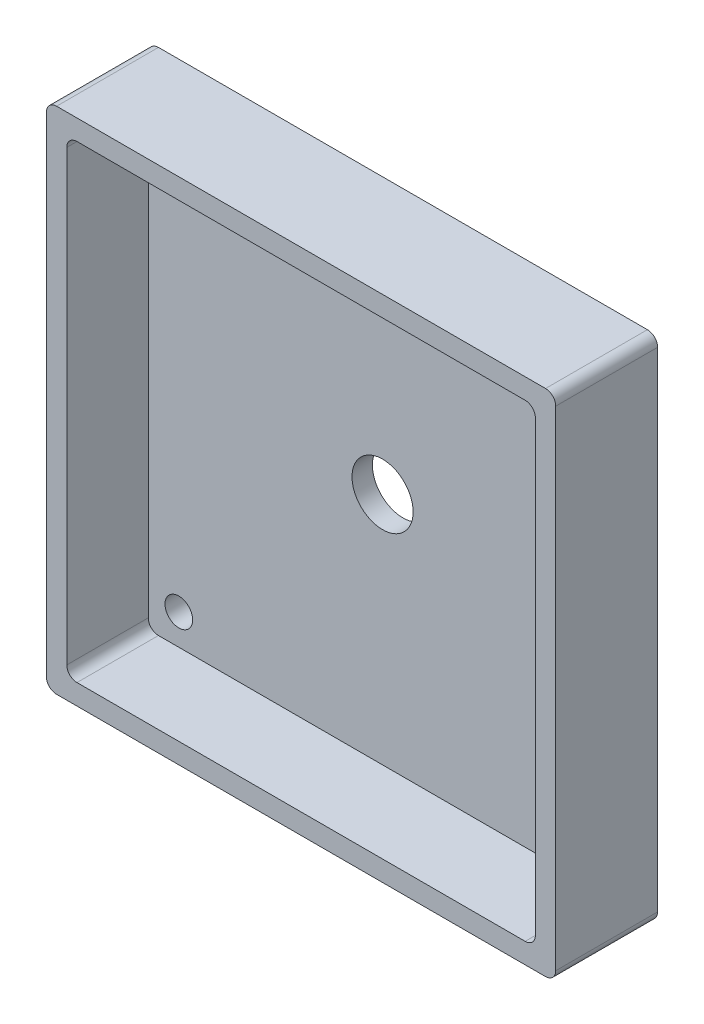
ISO-10303-21;
HEADER;
FILE_DESCRIPTION(('STEP AP214'),'2;1');
FILE_NAME('part.step','',(''),(''),'','','');
FILE_SCHEMA(('AUTOMOTIVE_DESIGN { 1 0 10303 214 1 1 1 1 }'));
ENDSEC;
DATA;
#1=APPLICATION_CONTEXT('core data for automotive mechanical design processes');
#2=APPLICATION_PROTOCOL_DEFINITION('international standard','automotive_design',2000,#1);
#3=PRODUCT_CONTEXT('',#1,'mechanical');
#4=PRODUCT('Part','Part','',(#3));
#5=PRODUCT_RELATED_PRODUCT_CATEGORY('part','',(#4));
#6=PRODUCT_DEFINITION_FORMATION('','',#4);
#7=PRODUCT_DEFINITION_CONTEXT('part definition',#1,'design');
#8=PRODUCT_DEFINITION('design','',#6,#7);
#9=PRODUCT_DEFINITION_SHAPE('','',#8);
#10=(LENGTH_UNIT() NAMED_UNIT(*) SI_UNIT(.MILLI.,.METRE.));
#11=(NAMED_UNIT(*) PLANE_ANGLE_UNIT() SI_UNIT($,.RADIAN.));
#12=(NAMED_UNIT(*) SI_UNIT($,.STERADIAN.) SOLID_ANGLE_UNIT());
#13=UNCERTAINTY_MEASURE_WITH_UNIT(LENGTH_MEASURE(1.E-05),#10,'distance_accuracy_value','');
#14=(GEOMETRIC_REPRESENTATION_CONTEXT(3) GLOBAL_UNCERTAINTY_ASSIGNED_CONTEXT((#13)) GLOBAL_UNIT_ASSIGNED_CONTEXT((#10,
#11,#12)) REPRESENTATION_CONTEXT('',''));
#15=CARTESIAN_POINT('',(0.,0.,0.));
#16=DIRECTION('',(0.,0.,1.));
#17=DIRECTION('',(1.,0.,0.));
#18=AXIS2_PLACEMENT_3D('',#15,#16,#17);
#19=CARTESIAN_POINT('',(-50.,50.,20.));
#20=DIRECTION('',(1.,0.,0.));
#21=DIRECTION('',(0.,1.,0.));
#22=AXIS2_PLACEMENT_3D('',#19,#20,#21);
#23=PLANE('',#22);
#24=DIRECTION('',(0.,-1.,0.));
#25=VECTOR('',#24,1.);
#26=CARTESIAN_POINT('',(-50.,50.,0.));
#27=LINE('',#26,#25);
#28=CARTESIAN_POINT('',(-50.,48.,0.));
#29=VERTEX_POINT('',#28);
#30=CARTESIAN_POINT('',(-50.,-48.,0.));
#31=VERTEX_POINT('',#30);
#32=EDGE_CURVE('E204',#29,#31,#27,.T.);
#33=ORIENTED_EDGE('',*,*,#32,.T.);
#34=DIRECTION('',(0.,0.,-1.));
#35=VECTOR('',#34,1.);
#36=CARTESIAN_POINT('',(-50.,-48.,20.));
#37=LINE('',#36,#35);
#38=CARTESIAN_POINT('',(-50.,-48.,20.));
#39=VERTEX_POINT('',#38);
#40=EDGE_CURVE('E264',#31,#39,#37,.F.);
#41=ORIENTED_EDGE('',*,*,#40,.T.);
#42=DIRECTION('',(0.,-1.,0.));
#43=VECTOR('',#42,1.);
#44=CARTESIAN_POINT('',(-50.,50.,20.));
#45=LINE('',#44,#43);
#46=CARTESIAN_POINT('',(-50.,48.,20.));
#47=VERTEX_POINT('',#46);
#48=EDGE_CURVE('E193',#47,#39,#45,.T.);
#49=ORIENTED_EDGE('',*,*,#48,.F.);
#50=DIRECTION('',(0.,0.,-1.));
#51=VECTOR('',#50,1.);
#52=CARTESIAN_POINT('',(-50.,48.,20.));
#53=LINE('',#52,#51);
#54=EDGE_CURVE('E261',#47,#29,#53,.T.);
#55=ORIENTED_EDGE('',*,*,#54,.T.);
#56=EDGE_LOOP('',(#33,#41,#49,#55));
#57=FACE_BOUND('',#56,.T.);
#58=ADVANCED_FACE('F37',(#57),#23,.F.);
#59=CARTESIAN_POINT('',(50.,-50.,20.));
#60=DIRECTION('',(0.,1.,0.));
#61=DIRECTION('',(-1.,0.,0.));
#62=AXIS2_PLACEMENT_3D('',#59,#60,#61);
#63=PLANE('',#62);
#64=DIRECTION('',(1.,0.,0.));
#65=VECTOR('',#64,1.);
#66=CARTESIAN_POINT('',(50.,-50.,0.));
#67=LINE('',#66,#65);
#68=CARTESIAN_POINT('',(-48.,-50.,0.));
#69=VERTEX_POINT('',#68);
#70=CARTESIAN_POINT('',(48.,-50.,0.));
#71=VERTEX_POINT('',#70);
#72=EDGE_CURVE('E207',#69,#71,#67,.T.);
#73=ORIENTED_EDGE('',*,*,#72,.T.);
#74=DIRECTION('',(0.,0.,-1.));
#75=VECTOR('',#74,1.);
#76=CARTESIAN_POINT('',(48.,-50.,20.));
#77=LINE('',#76,#75);
#78=CARTESIAN_POINT('',(48.,-50.,20.));
#79=VERTEX_POINT('',#78);
#80=EDGE_CURVE('E252',#71,#79,#77,.F.);
#81=ORIENTED_EDGE('',*,*,#80,.T.);
#82=DIRECTION('',(1.,0.,0.));
#83=VECTOR('',#82,1.);
#84=CARTESIAN_POINT('',(50.,-50.,20.));
#85=LINE('',#84,#83);
#86=CARTESIAN_POINT('',(-48.,-50.,20.));
#87=VERTEX_POINT('',#86);
#88=EDGE_CURVE('E196',#87,#79,#85,.T.);
#89=ORIENTED_EDGE('',*,*,#88,.F.);
#90=DIRECTION('',(0.,0.,-1.));
#91=VECTOR('',#90,1.);
#92=CARTESIAN_POINT('',(-48.,-50.,20.));
#93=LINE('',#92,#91);
#94=EDGE_CURVE('E249',#87,#69,#93,.T.);
#95=ORIENTED_EDGE('',*,*,#94,.T.);
#96=EDGE_LOOP('',(#73,#81,#89,#95));
#97=FACE_BOUND('',#96,.T.);
#98=ADVANCED_FACE('F352',(#97),#63,.F.);
#99=CARTESIAN_POINT('',(50.,50.,20.));
#100=DIRECTION('',(-1.,0.,0.));
#101=DIRECTION('',(0.,-1.,0.));
#102=AXIS2_PLACEMENT_3D('',#99,#100,#101);
#103=PLANE('',#102);
#104=DIRECTION('',(0.,1.,0.));
#105=VECTOR('',#104,1.);
#106=CARTESIAN_POINT('',(50.,50.,20.));
#107=LINE('',#106,#105);
#108=CARTESIAN_POINT('',(50.,-48.,20.));
#109=VERTEX_POINT('',#108);
#110=CARTESIAN_POINT('',(50.,48.,20.));
#111=VERTEX_POINT('',#110);
#112=EDGE_CURVE('E200',#109,#111,#107,.T.);
#113=ORIENTED_EDGE('',*,*,#112,.F.);
#114=DIRECTION('',(0.,0.,-1.));
#115=VECTOR('',#114,1.);
#116=CARTESIAN_POINT('',(50.,-48.,20.));
#117=LINE('',#116,#115);
#118=CARTESIAN_POINT('',(50.,-48.,0.));
#119=VERTEX_POINT('',#118);
#120=EDGE_CURVE('E238',#109,#119,#117,.T.);
#121=ORIENTED_EDGE('',*,*,#120,.T.);
#122=DIRECTION('',(0.,1.,0.));
#123=VECTOR('',#122,1.);
#124=CARTESIAN_POINT('',(50.,50.,0.));
#125=LINE('',#124,#123);
#126=CARTESIAN_POINT('',(50.,48.,0.));
#127=VERTEX_POINT('',#126);
#128=EDGE_CURVE('E210',#119,#127,#125,.T.);
#129=ORIENTED_EDGE('',*,*,#128,.T.);
#130=DIRECTION('',(0.,0.,-1.));
#131=VECTOR('',#130,1.);
#132=CARTESIAN_POINT('',(50.,48.,20.));
#133=LINE('',#132,#131);
#134=EDGE_CURVE('E236',#127,#111,#133,.F.);
#135=ORIENTED_EDGE('',*,*,#134,.T.);
#136=EDGE_LOOP('',(#113,#121,#129,#135));
#137=FACE_BOUND('',#136,.T.);
#138=ADVANCED_FACE('F358',(#137),#103,.F.);
#139=CARTESIAN_POINT('',(50.,50.,20.));
#140=DIRECTION('',(0.,-1.,0.));
#141=DIRECTION('',(1.,0.,0.));
#142=AXIS2_PLACEMENT_3D('',#139,#140,#141);
#143=PLANE('',#142);
#144=DIRECTION('',(-1.,0.,0.));
#145=VECTOR('',#144,1.);
#146=CARTESIAN_POINT('',(50.,50.,0.));
#147=LINE('',#146,#145);
#148=CARTESIAN_POINT('',(48.,50.,0.));
#149=VERTEX_POINT('',#148);
#150=CARTESIAN_POINT('',(-48.,50.,0.));
#151=VERTEX_POINT('',#150);
#152=EDGE_CURVE('E197',#149,#151,#147,.T.);
#153=ORIENTED_EDGE('',*,*,#152,.T.);
#154=DIRECTION('',(0.,0.,-1.));
#155=VECTOR('',#154,1.);
#156=CARTESIAN_POINT('',(-48.,50.,20.));
#157=LINE('',#156,#155);
#158=CARTESIAN_POINT('',(-48.,50.,20.));
#159=VERTEX_POINT('',#158);
#160=EDGE_CURVE('E54',#151,#159,#157,.F.);
#161=ORIENTED_EDGE('',*,*,#160,.T.);
#162=DIRECTION('',(-1.,0.,0.));
#163=VECTOR('',#162,1.);
#164=CARTESIAN_POINT('',(50.,50.,20.));
#165=LINE('',#164,#163);
#166=CARTESIAN_POINT('',(48.,50.,20.));
#167=VERTEX_POINT('',#166);
#168=EDGE_CURVE('E202',#167,#159,#165,.T.);
#169=ORIENTED_EDGE('',*,*,#168,.F.);
#170=DIRECTION('',(0.,0.,-1.));
#171=VECTOR('',#170,1.);
#172=CARTESIAN_POINT('',(48.,50.,20.));
#173=LINE('',#172,#171);
#174=EDGE_CURVE('E266',#167,#149,#173,.T.);
#175=ORIENTED_EDGE('',*,*,#174,.T.);
#176=EDGE_LOOP('',(#153,#161,#169,#175));
#177=FACE_BOUND('',#176,.T.);
#178=ADVANCED_FACE('F549',(#177),#143,.F.);
#179=CARTESIAN_POINT('',(0.,0.,20.));
#180=DIRECTION('',(0.,0.,-1.));
#181=DIRECTION('',(-1.,0.,0.));
#182=AXIS2_PLACEMENT_3D('',#179,#180,#181);
#183=PLANE('',#182);
#184=DIRECTION('',(1.,0.,0.));
#185=VECTOR('',#184,1.);
#186=CARTESIAN_POINT('',(46.,-46.,20.));
#187=LINE('',#186,#185);
#188=CARTESIAN_POINT('',(-44.,-46.,20.));
#189=VERTEX_POINT('',#188);
#190=CARTESIAN_POINT('',(44.,-46.,20.));
#191=VERTEX_POINT('',#190);
#192=EDGE_CURVE('E178',#189,#191,#187,.T.);
#193=ORIENTED_EDGE('',*,*,#192,.F.);
#194=CARTESIAN_POINT('',(-44.,-44.,20.));
#195=DIRECTION('',(0.,0.,-1.));
#196=DIRECTION('',(-1.,0.,0.));
#197=AXIS2_PLACEMENT_3D('',#194,#195,#196);
#198=CIRCLE('',#197,2.);
#199=CARTESIAN_POINT('',(-46.,-44.,20.));
#200=VERTEX_POINT('',#199);
#201=EDGE_CURVE('E11',#189,#200,#198,.T.);
#202=ORIENTED_EDGE('',*,*,#201,.T.);
#203=DIRECTION('',(0.,-1.,0.));
#204=VECTOR('',#203,1.);
#205=CARTESIAN_POINT('',(-46.,-46.,20.));
#206=LINE('',#205,#204);
#207=CARTESIAN_POINT('',(-46.,44.,20.));
#208=VERTEX_POINT('',#207);
#209=EDGE_CURVE('E169',#208,#200,#206,.T.);
#210=ORIENTED_EDGE('',*,*,#209,.F.);
#211=CARTESIAN_POINT('',(-44.,44.,20.));
#212=DIRECTION('',(0.,0.,-1.));
#213=DIRECTION('',(-1.,0.,0.));
#214=AXIS2_PLACEMENT_3D('',#211,#212,#213);
#215=CIRCLE('',#214,2.);
#216=CARTESIAN_POINT('',(-44.,46.,20.));
#217=VERTEX_POINT('',#216);
#218=EDGE_CURVE('E153',#208,#217,#215,.T.);
#219=ORIENTED_EDGE('',*,*,#218,.T.);
#220=DIRECTION('',(-1.,0.,0.));
#221=VECTOR('',#220,1.);
#222=CARTESIAN_POINT('',(46.,46.,20.));
#223=LINE('',#222,#221);
#224=CARTESIAN_POINT('',(44.,46.,20.));
#225=VERTEX_POINT('',#224);
#226=EDGE_CURVE('E191',#225,#217,#223,.T.);
#227=ORIENTED_EDGE('',*,*,#226,.F.);
#228=CARTESIAN_POINT('',(44.,44.,20.));
#229=DIRECTION('',(0.,0.,-1.));
#230=DIRECTION('',(-1.,0.,0.));
#231=AXIS2_PLACEMENT_3D('',#228,#229,#230);
#232=CIRCLE('',#231,2.);
#233=CARTESIAN_POINT('',(46.,44.,20.));
#234=VERTEX_POINT('',#233);
#235=EDGE_CURVE('E163',#225,#234,#232,.T.);
#236=ORIENTED_EDGE('',*,*,#235,.T.);
#237=DIRECTION('',(0.,1.,0.));
#238=VECTOR('',#237,1.);
#239=CARTESIAN_POINT('',(46.,-46.,20.));
#240=LINE('',#239,#238);
#241=CARTESIAN_POINT('',(46.,-44.,20.));
#242=VERTEX_POINT('',#241);
#243=EDGE_CURVE('E181',#242,#234,#240,.T.);
#244=ORIENTED_EDGE('',*,*,#243,.F.);
#245=CARTESIAN_POINT('',(44.,-44.,20.));
#246=DIRECTION('',(0.,0.,-1.));
#247=DIRECTION('',(-1.,0.,0.));
#248=AXIS2_PLACEMENT_3D('',#245,#246,#247);
#249=CIRCLE('',#248,2.);
#250=EDGE_CURVE('E46',#242,#191,#249,.T.);
#251=ORIENTED_EDGE('',*,*,#250,.T.);
#252=EDGE_LOOP('',(#193,#202,#210,#219,#227,#236,#244,#251));
#253=FACE_BOUND('',#252,.T.);
#254=ORIENTED_EDGE('',*,*,#88,.T.);
#255=CARTESIAN_POINT('',(48.,-48.,20.));
#256=DIRECTION('',(0.,0.,-1.));
#257=DIRECTION('',(-1.,0.,0.));
#258=AXIS2_PLACEMENT_3D('',#255,#256,#257);
#259=CIRCLE('',#258,2.);
#260=EDGE_CURVE('E259',#79,#109,#259,.F.);
#261=ORIENTED_EDGE('',*,*,#260,.T.);
#262=ORIENTED_EDGE('',*,*,#112,.T.);
#263=CARTESIAN_POINT('',(48.,48.,20.));
#264=DIRECTION('',(0.,0.,-1.));
#265=DIRECTION('',(-1.,0.,0.));
#266=AXIS2_PLACEMENT_3D('',#263,#264,#265);
#267=CIRCLE('',#266,2.);
#268=EDGE_CURVE('E61',#111,#167,#267,.F.);
#269=ORIENTED_EDGE('',*,*,#268,.T.);
#270=ORIENTED_EDGE('',*,*,#168,.T.);
#271=CARTESIAN_POINT('',(-48.,48.,20.));
#272=DIRECTION('',(0.,0.,-1.));
#273=DIRECTION('',(-1.,0.,0.));
#274=AXIS2_PLACEMENT_3D('',#271,#272,#273);
#275=CIRCLE('',#274,2.);
#276=EDGE_CURVE('E255',#159,#47,#275,.F.);
#277=ORIENTED_EDGE('',*,*,#276,.T.);
#278=ORIENTED_EDGE('',*,*,#48,.T.);
#279=CARTESIAN_POINT('',(-48.,-48.,20.));
#280=DIRECTION('',(0.,0.,-1.));
#281=DIRECTION('',(-1.,0.,0.));
#282=AXIS2_PLACEMENT_3D('',#279,#280,#281);
#283=CIRCLE('',#282,2.);
#284=EDGE_CURVE('E257',#39,#87,#283,.F.);
#285=ORIENTED_EDGE('',*,*,#284,.T.);
#286=EDGE_LOOP('',(#254,#261,#262,#269,#270,#277,#278,#285));
#287=FACE_BOUND('',#286,.T.);
#288=ADVANCED_FACE('F177',(#253,#287),#183,.F.);
#289=CARTESIAN_POINT('',(0.,0.,0.));
#290=DIRECTION('',(0.,0.,-1.));
#291=DIRECTION('',(-1.,0.,0.));
#292=AXIS2_PLACEMENT_3D('',#289,#290,#291);
#293=PLANE('',#292);
#294=CARTESIAN_POINT('',(-39.9999999999977,-40.,0.));
#295=DIRECTION('',(0.,0.,1.));
#296=DIRECTION('',(1.,0.,0.));
#297=AXIS2_PLACEMENT_3D('',#294,#295,#296);
#298=CIRCLE('',#297,2.71396680124798);
#299=CARTESIAN_POINT('',(-37.2860331987498,-40.,0.));
#300=VERTEX_POINT('',#299);
#301=EDGE_CURVE('E298',#300,#300,#298,.T.);
#302=ORIENTED_EDGE('',*,*,#301,.T.);
#303=EDGE_LOOP('',(#302));
#304=FACE_BOUND('',#303,.T.);
#305=CARTESIAN_POINT('',(40.0000000000023,-39.9999999999978,0.));
#306=DIRECTION('',(0.,0.,1.));
#307=DIRECTION('',(1.,0.,0.));
#308=AXIS2_PLACEMENT_3D('',#305,#306,#307);
#309=CIRCLE('',#308,2.71396680124995);
#310=CARTESIAN_POINT('',(42.7139668012522,-39.9999999999978,0.));
#311=VERTEX_POINT('',#310);
#312=EDGE_CURVE('E295',#311,#311,#309,.T.);
#313=ORIENTED_EDGE('',*,*,#312,.T.);
#314=EDGE_LOOP('',(#313));
#315=FACE_BOUND('',#314,.T.);
#316=CARTESIAN_POINT('',(40.,40.0000000000023,0.));
#317=DIRECTION('',(0.,0.,1.));
#318=DIRECTION('',(1.,0.,0.));
#319=AXIS2_PLACEMENT_3D('',#316,#317,#318);
#320=CIRCLE('',#319,2.71396680124912);
#321=CARTESIAN_POINT('',(42.7139668012491,40.0000000000023,0.));
#322=VERTEX_POINT('',#321);
#323=EDGE_CURVE('E297',#322,#322,#320,.T.);
#324=ORIENTED_EDGE('',*,*,#323,.T.);
#325=EDGE_LOOP('',(#324));
#326=FACE_BOUND('',#325,.T.);
#327=CARTESIAN_POINT('',(-40.,40.,0.));
#328=DIRECTION('',(0.,0.,1.));
#329=DIRECTION('',(1.,0.,0.));
#330=AXIS2_PLACEMENT_3D('',#327,#328,#329);
#331=CIRCLE('',#330,2.71396680124678);
#332=CARTESIAN_POINT('',(-37.2860331987532,40.,0.));
#333=VERTEX_POINT('',#332);
#334=EDGE_CURVE('E301',#333,#333,#331,.T.);
#335=ORIENTED_EDGE('',*,*,#334,.T.);
#336=EDGE_LOOP('',(#335));
#337=FACE_BOUND('',#336,.T.);
#338=CARTESIAN_POINT('',(0.,0.,0.));
#339=DIRECTION('',(0.,0.,1.));
#340=DIRECTION('',(1.,0.,0.));
#341=AXIS2_PLACEMENT_3D('',#338,#339,#340);
#342=CIRCLE('',#341,6.);
#343=CARTESIAN_POINT('',(6.,0.,0.));
#344=VERTEX_POINT('',#343);
#345=EDGE_CURVE('E276',#344,#344,#342,.T.);
#346=ORIENTED_EDGE('',*,*,#345,.T.);
#347=EDGE_LOOP('',(#346));
#348=FACE_BOUND('',#347,.T.);
#349=ORIENTED_EDGE('',*,*,#128,.F.);
#350=CARTESIAN_POINT('',(48.,-48.,0.));
#351=DIRECTION('',(0.,0.,-1.));
#352=DIRECTION('',(-1.,0.,0.));
#353=AXIS2_PLACEMENT_3D('',#350,#351,#352);
#354=CIRCLE('',#353,2.);
#355=EDGE_CURVE('E247',#119,#71,#354,.T.);
#356=ORIENTED_EDGE('',*,*,#355,.T.);
#357=ORIENTED_EDGE('',*,*,#72,.F.);
#358=CARTESIAN_POINT('',(-48.,-48.,0.));
#359=DIRECTION('',(0.,0.,-1.));
#360=DIRECTION('',(-1.,0.,0.));
#361=AXIS2_PLACEMENT_3D('',#358,#359,#360);
#362=CIRCLE('',#361,2.);
#363=EDGE_CURVE('E245',#69,#31,#362,.T.);
#364=ORIENTED_EDGE('',*,*,#363,.T.);
#365=ORIENTED_EDGE('',*,*,#32,.F.);
#366=CARTESIAN_POINT('',(-48.,48.,0.));
#367=DIRECTION('',(0.,0.,-1.));
#368=DIRECTION('',(-1.,0.,0.));
#369=AXIS2_PLACEMENT_3D('',#366,#367,#368);
#370=CIRCLE('',#369,2.);
#371=EDGE_CURVE('E243',#29,#151,#370,.T.);
#372=ORIENTED_EDGE('',*,*,#371,.T.);
#373=ORIENTED_EDGE('',*,*,#152,.F.);
#374=CARTESIAN_POINT('',(48.,48.,0.));
#375=DIRECTION('',(0.,0.,-1.));
#376=DIRECTION('',(-1.,0.,0.));
#377=AXIS2_PLACEMENT_3D('',#374,#375,#376);
#378=CIRCLE('',#377,2.);
#379=EDGE_CURVE('E241',#149,#127,#378,.T.);
#380=ORIENTED_EDGE('',*,*,#379,.T.);
#381=EDGE_LOOP('',(#349,#356,#357,#364,#365,#372,#373,#380));
#382=FACE_BOUND('',#381,.T.);
#383=ADVANCED_FACE('F425',(#304,#315,#326,#337,#348,#382),#293,.T.);
#384=CARTESIAN_POINT('',(-46.,-46.,4.));
#385=DIRECTION('',(-1.,0.,0.));
#386=DIRECTION('',(0.,0.,1.));
#387=AXIS2_PLACEMENT_3D('',#384,#385,#386);
#388=PLANE('',#387);
#389=DIRECTION('',(0.,-1.,0.));
#390=VECTOR('',#389,1.);
#391=CARTESIAN_POINT('',(-46.,-46.,4.));
#392=LINE('',#391,#390);
#393=CARTESIAN_POINT('',(-46.,44.,4.));
#394=VERTEX_POINT('',#393);
#395=CARTESIAN_POINT('',(-46.,-44.,4.));
#396=VERTEX_POINT('',#395);
#397=EDGE_CURVE('E172',#394,#396,#392,.T.);
#398=ORIENTED_EDGE('',*,*,#397,.F.);
#399=DIRECTION('',(0.,0.,1.));
#400=VECTOR('',#399,1.);
#401=CARTESIAN_POINT('',(-46.,44.,20.));
#402=LINE('',#401,#400);
#403=EDGE_CURVE('E157',#394,#208,#402,.T.);
#404=ORIENTED_EDGE('',*,*,#403,.T.);
#405=ORIENTED_EDGE('',*,*,#209,.T.);
#406=DIRECTION('',(0.,0.,1.));
#407=VECTOR('',#406,1.);
#408=CARTESIAN_POINT('',(-46.,-44.,4.));
#409=LINE('',#408,#407);
#410=EDGE_CURVE('E174',#200,#396,#409,.F.);
#411=ORIENTED_EDGE('',*,*,#410,.T.);
#412=EDGE_LOOP('',(#398,#404,#405,#411));
#413=FACE_BOUND('',#412,.T.);
#414=ADVANCED_FACE('F168',(#413),#388,.F.);
#415=CARTESIAN_POINT('',(46.,46.,4.));
#416=DIRECTION('',(0.,1.,0.));
#417=DIRECTION('',(-1.,0.,0.));
#418=AXIS2_PLACEMENT_3D('',#415,#416,#417);
#419=PLANE('',#418);
#420=ORIENTED_EDGE('',*,*,#226,.T.);
#421=DIRECTION('',(0.,0.,1.));
#422=VECTOR('',#421,1.);
#423=CARTESIAN_POINT('',(-44.,46.,4.));
#424=LINE('',#423,#422);
#425=CARTESIAN_POINT('',(-44.,46.,4.));
#426=VERTEX_POINT('',#425);
#427=EDGE_CURVE('E158',#217,#426,#424,.F.);
#428=ORIENTED_EDGE('',*,*,#427,.T.);
#429=DIRECTION('',(-1.,0.,0.));
#430=VECTOR('',#429,1.);
#431=CARTESIAN_POINT('',(46.,46.,4.));
#432=LINE('',#431,#430);
#433=CARTESIAN_POINT('',(44.,46.,4.));
#434=VERTEX_POINT('',#433);
#435=EDGE_CURVE('E186',#434,#426,#432,.T.);
#436=ORIENTED_EDGE('',*,*,#435,.F.);
#437=DIRECTION('',(0.,0.,1.));
#438=VECTOR('',#437,1.);
#439=CARTESIAN_POINT('',(44.,46.,20.));
#440=LINE('',#439,#438);
#441=EDGE_CURVE('E173',#434,#225,#440,.T.);
#442=ORIENTED_EDGE('',*,*,#441,.T.);
#443=EDGE_LOOP('',(#420,#428,#436,#442));
#444=FACE_BOUND('',#443,.T.);
#445=ADVANCED_FACE('F321',(#444),#419,.F.);
#446=CARTESIAN_POINT('',(46.,-46.,4.));
#447=DIRECTION('',(1.,0.,0.));
#448=DIRECTION('',(0.,0.,-1.));
#449=AXIS2_PLACEMENT_3D('',#446,#447,#448);
#450=PLANE('',#449);
#451=ORIENTED_EDGE('',*,*,#243,.T.);
#452=DIRECTION('',(0.,0.,1.));
#453=VECTOR('',#452,1.);
#454=CARTESIAN_POINT('',(46.,44.,4.));
#455=LINE('',#454,#453);
#456=CARTESIAN_POINT('',(46.,44.,4.));
#457=VERTEX_POINT('',#456);
#458=EDGE_CURVE('E229',#234,#457,#455,.F.);
#459=ORIENTED_EDGE('',*,*,#458,.T.);
#460=DIRECTION('',(0.,1.,0.));
#461=VECTOR('',#460,1.);
#462=CARTESIAN_POINT('',(46.,-46.,4.));
#463=LINE('',#462,#461);
#464=CARTESIAN_POINT('',(46.,-44.,4.));
#465=VERTEX_POINT('',#464);
#466=EDGE_CURVE('E312',#465,#457,#463,.T.);
#467=ORIENTED_EDGE('',*,*,#466,.F.);
#468=DIRECTION('',(0.,0.,1.));
#469=VECTOR('',#468,1.);
#470=CARTESIAN_POINT('',(46.,-44.,20.));
#471=LINE('',#470,#469);
#472=EDGE_CURVE('E226',#465,#242,#471,.T.);
#473=ORIENTED_EDGE('',*,*,#472,.T.);
#474=EDGE_LOOP('',(#451,#459,#467,#473));
#475=FACE_BOUND('',#474,.T.);
#476=ADVANCED_FACE('F327',(#475),#450,.F.);
#477=CARTESIAN_POINT('',(46.,-46.,4.));
#478=DIRECTION('',(0.,-1.,0.));
#479=DIRECTION('',(1.,0.,0.));
#480=AXIS2_PLACEMENT_3D('',#477,#478,#479);
#481=PLANE('',#480);
#482=ORIENTED_EDGE('',*,*,#192,.T.);
#483=DIRECTION('',(0.,0.,1.));
#484=VECTOR('',#483,1.);
#485=CARTESIAN_POINT('',(44.,-46.,4.));
#486=LINE('',#485,#484);
#487=CARTESIAN_POINT('',(44.,-46.,4.));
#488=VERTEX_POINT('',#487);
#489=EDGE_CURVE('E234',#191,#488,#486,.F.);
#490=ORIENTED_EDGE('',*,*,#489,.T.);
#491=DIRECTION('',(1.,0.,0.));
#492=VECTOR('',#491,1.);
#493=CARTESIAN_POINT('',(46.,-46.,4.));
#494=LINE('',#493,#492);
#495=CARTESIAN_POINT('',(-44.,-46.,4.));
#496=VERTEX_POINT('',#495);
#497=EDGE_CURVE('E310',#496,#488,#494,.T.);
#498=ORIENTED_EDGE('',*,*,#497,.F.);
#499=DIRECTION('',(0.,0.,1.));
#500=VECTOR('',#499,1.);
#501=CARTESIAN_POINT('',(-44.,-46.,20.));
#502=LINE('',#501,#500);
#503=EDGE_CURVE('E231',#496,#189,#502,.T.);
#504=ORIENTED_EDGE('',*,*,#503,.T.);
#505=EDGE_LOOP('',(#482,#490,#498,#504));
#506=FACE_BOUND('',#505,.T.);
#507=ADVANCED_FACE('F334',(#506),#481,.F.);
#508=CARTESIAN_POINT('',(0.,0.,4.));
#509=DIRECTION('',(0.,0.,1.));
#510=DIRECTION('',(1.,0.,0.));
#511=AXIS2_PLACEMENT_3D('',#508,#509,#510);
#512=PLANE('',#511);
#513=CARTESIAN_POINT('',(-39.9999999999977,-40.,4.));
#514=DIRECTION('',(0.,0.,1.));
#515=DIRECTION('',(1.,0.,0.));
#516=AXIS2_PLACEMENT_3D('',#513,#514,#515);
#517=CIRCLE('',#516,2.71396680124798);
#518=CARTESIAN_POINT('',(-37.2860331987498,-40.,4.));
#519=VERTEX_POINT('',#518);
#520=EDGE_CURVE('E41',#519,#519,#517,.F.);
#521=ORIENTED_EDGE('',*,*,#520,.T.);
#522=EDGE_LOOP('',(#521));
#523=FACE_BOUND('',#522,.T.);
#524=CARTESIAN_POINT('',(40.0000000000023,-39.9999999999978,4.));
#525=DIRECTION('',(0.,0.,1.));
#526=DIRECTION('',(1.,0.,0.));
#527=AXIS2_PLACEMENT_3D('',#524,#525,#526);
#528=CIRCLE('',#527,2.71396680124995);
#529=CARTESIAN_POINT('',(42.7139668012522,-39.9999999999978,4.));
#530=VERTEX_POINT('',#529);
#531=EDGE_CURVE('E184',#530,#530,#528,.F.);
#532=ORIENTED_EDGE('',*,*,#531,.T.);
#533=EDGE_LOOP('',(#532));
#534=FACE_BOUND('',#533,.T.);
#535=CARTESIAN_POINT('',(40.,40.0000000000023,4.));
#536=DIRECTION('',(0.,0.,1.));
#537=DIRECTION('',(1.,0.,0.));
#538=AXIS2_PLACEMENT_3D('',#535,#536,#537);
#539=CIRCLE('',#538,2.71396680124912);
#540=CARTESIAN_POINT('',(42.7139668012491,40.0000000000023,4.));
#541=VERTEX_POINT('',#540);
#542=EDGE_CURVE('E279',#541,#541,#539,.F.);
#543=ORIENTED_EDGE('',*,*,#542,.T.);
#544=EDGE_LOOP('',(#543));
#545=FACE_BOUND('',#544,.T.);
#546=CARTESIAN_POINT('',(-40.,40.,4.));
#547=DIRECTION('',(0.,0.,1.));
#548=DIRECTION('',(1.,0.,0.));
#549=AXIS2_PLACEMENT_3D('',#546,#547,#548);
#550=CIRCLE('',#549,2.71396680124678);
#551=CARTESIAN_POINT('',(-37.2860331987532,40.,4.));
#552=VERTEX_POINT('',#551);
#553=EDGE_CURVE('E275',#552,#552,#550,.F.);
#554=ORIENTED_EDGE('',*,*,#553,.T.);
#555=EDGE_LOOP('',(#554));
#556=FACE_BOUND('',#555,.T.);
#557=CARTESIAN_POINT('',(0.,0.,4.));
#558=DIRECTION('',(0.,0.,1.));
#559=DIRECTION('',(1.,0.,0.));
#560=AXIS2_PLACEMENT_3D('',#557,#558,#559);
#561=CIRCLE('',#560,6.);
#562=CARTESIAN_POINT('',(6.,0.,4.));
#563=VERTEX_POINT('',#562);
#564=EDGE_CURVE('E272',#563,#563,#561,.F.);
#565=ORIENTED_EDGE('',*,*,#564,.T.);
#566=EDGE_LOOP('',(#565));
#567=FACE_BOUND('',#566,.T.);
#568=ORIENTED_EDGE('',*,*,#435,.T.);
#569=CARTESIAN_POINT('',(-44.,44.,4.));
#570=DIRECTION('',(0.,0.,1.));
#571=DIRECTION('',(1.,0.,0.));
#572=AXIS2_PLACEMENT_3D('',#569,#570,#571);
#573=CIRCLE('',#572,2.);
#574=EDGE_CURVE('E224',#426,#394,#573,.T.);
#575=ORIENTED_EDGE('',*,*,#574,.T.);
#576=ORIENTED_EDGE('',*,*,#397,.T.);
#577=CARTESIAN_POINT('',(-44.,-44.,4.));
#578=DIRECTION('',(0.,0.,1.));
#579=DIRECTION('',(1.,0.,0.));
#580=AXIS2_PLACEMENT_3D('',#577,#578,#579);
#581=CIRCLE('',#580,2.);
#582=EDGE_CURVE('E218',#396,#496,#581,.T.);
#583=ORIENTED_EDGE('',*,*,#582,.T.);
#584=ORIENTED_EDGE('',*,*,#497,.T.);
#585=CARTESIAN_POINT('',(44.,-44.,4.));
#586=DIRECTION('',(0.,0.,1.));
#587=DIRECTION('',(1.,0.,0.));
#588=AXIS2_PLACEMENT_3D('',#585,#586,#587);
#589=CIRCLE('',#588,2.);
#590=EDGE_CURVE('E220',#488,#465,#589,.T.);
#591=ORIENTED_EDGE('',*,*,#590,.T.);
#592=ORIENTED_EDGE('',*,*,#466,.T.);
#593=CARTESIAN_POINT('',(44.,44.,4.));
#594=DIRECTION('',(0.,0.,1.));
#595=DIRECTION('',(1.,0.,0.));
#596=AXIS2_PLACEMENT_3D('',#593,#594,#595);
#597=CIRCLE('',#596,2.);
#598=EDGE_CURVE('E222',#457,#434,#597,.T.);
#599=ORIENTED_EDGE('',*,*,#598,.T.);
#600=EDGE_LOOP('',(#568,#575,#576,#583,#584,#591,#592,#599));
#601=FACE_BOUND('',#600,.T.);
#602=ADVANCED_FACE('F284',(#523,#534,#545,#556,#567,#601),#512,.T.);
#603=CARTESIAN_POINT('',(-44.,44.,4.));
#604=DIRECTION('',(0.,0.,-1.));
#605=DIRECTION('',(-1.,0.,0.));
#606=AXIS2_PLACEMENT_3D('',#603,#604,#605);
#607=CYLINDRICAL_SURFACE('',#606,2.);
#608=ORIENTED_EDGE('',*,*,#574,.F.);
#609=ORIENTED_EDGE('',*,*,#427,.F.);
#610=ORIENTED_EDGE('',*,*,#218,.F.);
#611=ORIENTED_EDGE('',*,*,#403,.F.);
#612=EDGE_LOOP('',(#608,#609,#610,#611));
#613=FACE_BOUND('',#612,.T.);
#614=ADVANCED_FACE('F156',(#613),#607,.F.);
#615=CARTESIAN_POINT('',(44.,44.,4.));
#616=DIRECTION('',(0.,0.,-1.));
#617=DIRECTION('',(-1.,0.,0.));
#618=AXIS2_PLACEMENT_3D('',#615,#616,#617);
#619=CYLINDRICAL_SURFACE('',#618,2.);
#620=ORIENTED_EDGE('',*,*,#598,.F.);
#621=ORIENTED_EDGE('',*,*,#458,.F.);
#622=ORIENTED_EDGE('',*,*,#235,.F.);
#623=ORIENTED_EDGE('',*,*,#441,.F.);
#624=EDGE_LOOP('',(#620,#621,#622,#623));
#625=FACE_BOUND('',#624,.T.);
#626=ADVANCED_FACE('F323',(#625),#619,.F.);
#627=CARTESIAN_POINT('',(44.,-44.,4.));
#628=DIRECTION('',(0.,0.,-1.));
#629=DIRECTION('',(-1.,0.,0.));
#630=AXIS2_PLACEMENT_3D('',#627,#628,#629);
#631=CYLINDRICAL_SURFACE('',#630,2.);
#632=ORIENTED_EDGE('',*,*,#590,.F.);
#633=ORIENTED_EDGE('',*,*,#489,.F.);
#634=ORIENTED_EDGE('',*,*,#250,.F.);
#635=ORIENTED_EDGE('',*,*,#472,.F.);
#636=EDGE_LOOP('',(#632,#633,#634,#635));
#637=FACE_BOUND('',#636,.T.);
#638=ADVANCED_FACE('F331',(#637),#631,.F.);
#639=CARTESIAN_POINT('',(-44.,-44.,4.));
#640=DIRECTION('',(0.,0.,-1.));
#641=DIRECTION('',(-1.,0.,0.));
#642=AXIS2_PLACEMENT_3D('',#639,#640,#641);
#643=CYLINDRICAL_SURFACE('',#642,2.);
#644=ORIENTED_EDGE('',*,*,#582,.F.);
#645=ORIENTED_EDGE('',*,*,#410,.F.);
#646=ORIENTED_EDGE('',*,*,#201,.F.);
#647=ORIENTED_EDGE('',*,*,#503,.F.);
#648=EDGE_LOOP('',(#644,#645,#646,#647));
#649=FACE_BOUND('',#648,.T.);
#650=ADVANCED_FACE('F339',(#649),#643,.F.);
#651=CARTESIAN_POINT('',(48.,-48.,20.));
#652=DIRECTION('',(0.,0.,-1.));
#653=DIRECTION('',(-1.,0.,0.));
#654=AXIS2_PLACEMENT_3D('',#651,#652,#653);
#655=CYLINDRICAL_SURFACE('',#654,2.);
#656=ORIENTED_EDGE('',*,*,#260,.F.);
#657=ORIENTED_EDGE('',*,*,#80,.F.);
#658=ORIENTED_EDGE('',*,*,#355,.F.);
#659=ORIENTED_EDGE('',*,*,#120,.F.);
#660=EDGE_LOOP('',(#656,#657,#658,#659));
#661=FACE_BOUND('',#660,.T.);
#662=ADVANCED_FACE('F341',(#661),#655,.T.);
#663=CARTESIAN_POINT('',(-48.,-48.,20.));
#664=DIRECTION('',(0.,0.,-1.));
#665=DIRECTION('',(-1.,0.,0.));
#666=AXIS2_PLACEMENT_3D('',#663,#664,#665);
#667=CYLINDRICAL_SURFACE('',#666,2.);
#668=ORIENTED_EDGE('',*,*,#284,.F.);
#669=ORIENTED_EDGE('',*,*,#40,.F.);
#670=ORIENTED_EDGE('',*,*,#363,.F.);
#671=ORIENTED_EDGE('',*,*,#94,.F.);
#672=EDGE_LOOP('',(#668,#669,#670,#671));
#673=FACE_BOUND('',#672,.T.);
#674=ADVANCED_FACE('F347',(#673),#667,.T.);
#675=CARTESIAN_POINT('',(-48.,48.,20.));
#676=DIRECTION('',(0.,0.,-1.));
#677=DIRECTION('',(-1.,0.,0.));
#678=AXIS2_PLACEMENT_3D('',#675,#676,#677);
#679=CYLINDRICAL_SURFACE('',#678,2.);
#680=ORIENTED_EDGE('',*,*,#276,.F.);
#681=ORIENTED_EDGE('',*,*,#160,.F.);
#682=ORIENTED_EDGE('',*,*,#371,.F.);
#683=ORIENTED_EDGE('',*,*,#54,.F.);
#684=EDGE_LOOP('',(#680,#681,#682,#683));
#685=FACE_BOUND('',#684,.T.);
#686=ADVANCED_FACE('F397',(#685),#679,.T.);
#687=CARTESIAN_POINT('',(48.,48.,20.));
#688=DIRECTION('',(0.,0.,-1.));
#689=DIRECTION('',(-1.,0.,0.));
#690=AXIS2_PLACEMENT_3D('',#687,#688,#689);
#691=CYLINDRICAL_SURFACE('',#690,2.);
#692=ORIENTED_EDGE('',*,*,#268,.F.);
#693=ORIENTED_EDGE('',*,*,#134,.F.);
#694=ORIENTED_EDGE('',*,*,#379,.F.);
#695=ORIENTED_EDGE('',*,*,#174,.F.);
#696=EDGE_LOOP('',(#692,#693,#694,#695));
#697=FACE_BOUND('',#696,.T.);
#698=ADVANCED_FACE('F39',(#697),#691,.T.);
#699=CARTESIAN_POINT('',(0.,0.,16.));
#700=DIRECTION('',(0.,0.,-1.));
#701=DIRECTION('',(-1.,0.,0.));
#702=AXIS2_PLACEMENT_3D('',#699,#700,#701);
#703=CYLINDRICAL_SURFACE('',#702,6.);
#704=ORIENTED_EDGE('',*,*,#564,.F.);
#705=EDGE_LOOP('',(#704));
#706=FACE_BOUND('',#705,.T.);
#707=ORIENTED_EDGE('',*,*,#345,.F.);
#708=EDGE_LOOP('',(#707));
#709=FACE_BOUND('',#708,.T.);
#710=ADVANCED_FACE('F417',(#706,#709),#703,.F.);
#711=CARTESIAN_POINT('',(-40.,40.,16.));
#712=DIRECTION('',(0.,0.,-1.));
#713=DIRECTION('',(-1.,0.,0.));
#714=AXIS2_PLACEMENT_3D('',#711,#712,#713);
#715=CYLINDRICAL_SURFACE('',#714,2.71396680124678);
#716=ORIENTED_EDGE('',*,*,#553,.F.);
#717=EDGE_LOOP('',(#716));
#718=FACE_BOUND('',#717,.T.);
#719=ORIENTED_EDGE('',*,*,#334,.F.);
#720=EDGE_LOOP('',(#719));
#721=FACE_BOUND('',#720,.T.);
#722=ADVANCED_FACE('F454',(#718,#721),#715,.F.);
#723=CARTESIAN_POINT('',(40.,40.0000000000023,16.));
#724=DIRECTION('',(0.,0.,-1.));
#725=DIRECTION('',(-1.,0.,0.));
#726=AXIS2_PLACEMENT_3D('',#723,#724,#725);
#727=CYLINDRICAL_SURFACE('',#726,2.71396680124912);
#728=ORIENTED_EDGE('',*,*,#542,.F.);
#729=EDGE_LOOP('',(#728));
#730=FACE_BOUND('',#729,.T.);
#731=ORIENTED_EDGE('',*,*,#323,.F.);
#732=EDGE_LOOP('',(#731));
#733=FACE_BOUND('',#732,.T.);
#734=ADVANCED_FACE('F291',(#730,#733),#727,.F.);
#735=CARTESIAN_POINT('',(40.0000000000023,-39.9999999999978,16.));
#736=DIRECTION('',(0.,0.,-1.));
#737=DIRECTION('',(-1.,0.,0.));
#738=AXIS2_PLACEMENT_3D('',#735,#736,#737);
#739=CYLINDRICAL_SURFACE('',#738,2.71396680124995);
#740=ORIENTED_EDGE('',*,*,#531,.F.);
#741=EDGE_LOOP('',(#740));
#742=FACE_BOUND('',#741,.T.);
#743=ORIENTED_EDGE('',*,*,#312,.F.);
#744=EDGE_LOOP('',(#743));
#745=FACE_BOUND('',#744,.T.);
#746=ADVANCED_FACE('F287',(#742,#745),#739,.F.);
#747=CARTESIAN_POINT('',(-39.9999999999977,-40.,16.));
#748=DIRECTION('',(0.,0.,-1.));
#749=DIRECTION('',(-1.,0.,0.));
#750=AXIS2_PLACEMENT_3D('',#747,#748,#749);
#751=CYLINDRICAL_SURFACE('',#750,2.71396680124798);
#752=ORIENTED_EDGE('',*,*,#520,.F.);
#753=EDGE_LOOP('',(#752));
#754=FACE_BOUND('',#753,.T.);
#755=ORIENTED_EDGE('',*,*,#301,.F.);
#756=EDGE_LOOP('',(#755));
#757=FACE_BOUND('',#756,.T.);
#758=ADVANCED_FACE('F290',(#754,#757),#751,.F.);
#759=CLOSED_SHELL('',(#58,#98,#138,#178,#288,#383,#414,#445,#476,#507,#602,#614,#626,#638,#650,
#662,#674,#686,#698,#710,#722,#734,#746,#758));
#760=MANIFOLD_SOLID_BREP('B2',#759);
#761=ADVANCED_BREP_SHAPE_REPRESENTATION('',(#18,#760),#14);
#762=SHAPE_DEFINITION_REPRESENTATION(#9,#761);
ENDSEC;
END-ISO-10303-21;
